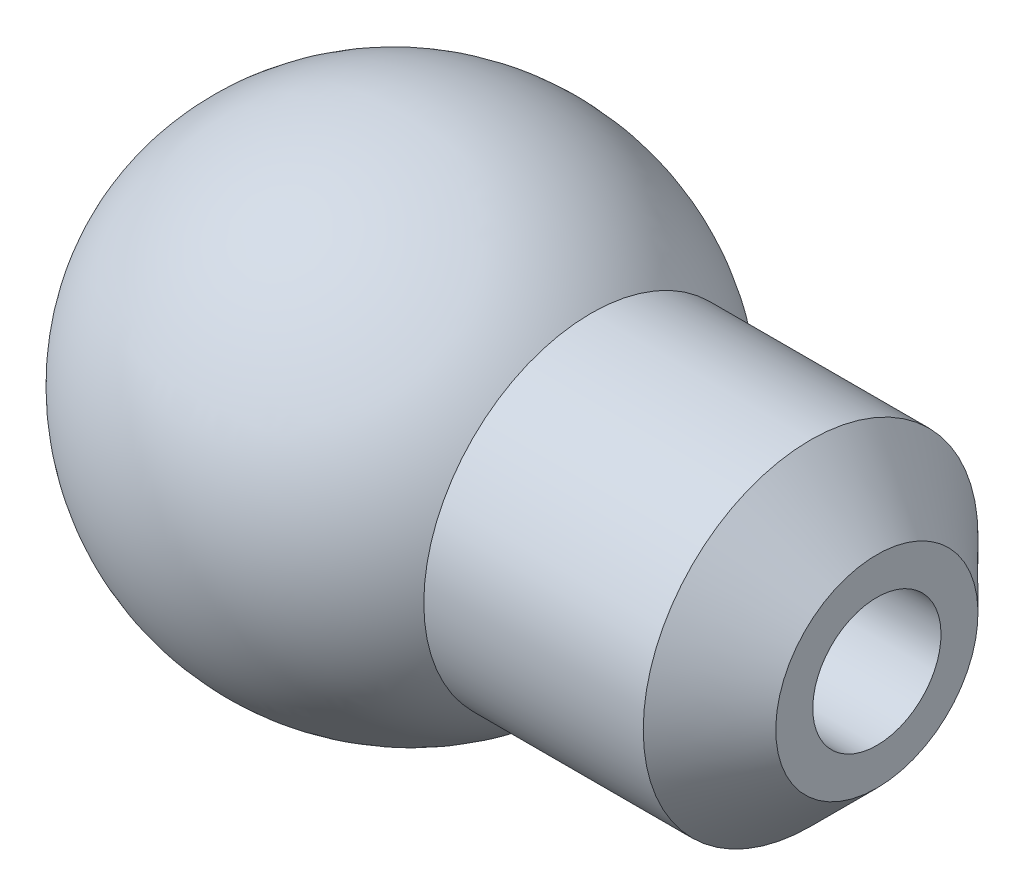
ISO-10303-21;
HEADER;
FILE_DESCRIPTION(('STEP AP214'),'2;1');
FILE_NAME('part.step','',(''),(''),'','','');
FILE_SCHEMA(('AUTOMOTIVE_DESIGN { 1 0 10303 214 1 1 1 1 }'));
ENDSEC;
DATA;
#1=APPLICATION_CONTEXT('core data for automotive mechanical design processes');
#2=APPLICATION_PROTOCOL_DEFINITION('international standard','automotive_design',2000,#1);
#3=PRODUCT_CONTEXT('',#1,'mechanical');
#4=PRODUCT('Part','Part','',(#3));
#5=PRODUCT_RELATED_PRODUCT_CATEGORY('part','',(#4));
#6=PRODUCT_DEFINITION_FORMATION('','',#4);
#7=PRODUCT_DEFINITION_CONTEXT('part definition',#1,'design');
#8=PRODUCT_DEFINITION('design','',#6,#7);
#9=PRODUCT_DEFINITION_SHAPE('','',#8);
#10=(LENGTH_UNIT() NAMED_UNIT(*) SI_UNIT(.MILLI.,.METRE.));
#11=(NAMED_UNIT(*) PLANE_ANGLE_UNIT() SI_UNIT($,.RADIAN.));
#12=(NAMED_UNIT(*) SI_UNIT($,.STERADIAN.) SOLID_ANGLE_UNIT());
#13=UNCERTAINTY_MEASURE_WITH_UNIT(LENGTH_MEASURE(1.E-05),#10,'distance_accuracy_value','');
#14=(GEOMETRIC_REPRESENTATION_CONTEXT(3) GLOBAL_UNCERTAINTY_ASSIGNED_CONTEXT((#13)) GLOBAL_UNIT_ASSIGNED_CONTEXT((#10,
#11,#12)) REPRESENTATION_CONTEXT('',''));
#15=CARTESIAN_POINT('',(0.,0.,0.));
#16=DIRECTION('',(0.,0.,1.));
#17=DIRECTION('',(1.,0.,0.));
#18=AXIS2_PLACEMENT_3D('',#15,#16,#17);
#19=CARTESIAN_POINT('',(0.,26.,0.));
#20=DIRECTION('',(-1.,0.,0.));
#21=DIRECTION('',(0.,-1.,0.));
#22=AXIS2_PLACEMENT_3D('',#19,#20,#21);
#23=PLANE('',#22);
#24=CARTESIAN_POINT('',(0.,0.,0.));
#25=DIRECTION('',(-1.,0.,0.));
#26=DIRECTION('',(0.,-1.,0.));
#27=AXIS2_PLACEMENT_3D('',#24,#25,#26);
#28=CIRCLE('',#27,26.);
#29=CARTESIAN_POINT('',(0.,-26.,0.));
#30=VERTEX_POINT('',#29);
#31=EDGE_CURVE('E65',#30,#30,#28,.T.);
#32=ORIENTED_EDGE('',*,*,#31,.F.);
#33=EDGE_LOOP('',(#32));
#34=FACE_BOUND('',#33,.T.);
#35=ADVANCED_FACE('F36',(#34),#23,.F.);
#36=CARTESIAN_POINT('',(-132.448093388028,8.05657132717041,0.));
#37=DIRECTION('',(0.,0.,-1.));
#38=DIRECTION('',(0.,-1.,0.));
#39=AXIS2_PLACEMENT_3D('',#36,#37,#38);
#40=CIRCLE('',#39,107.853238047915);
#41=TRIMMED_CURVE('',#40,(PARAMETER_VALUE(-1.4960272891652)),(PARAMETER_VALUE(1.4960272891652)),
.T.,.PARAMETER.);
#42=CARTESIAN_POINT('',(-132.448093388028,0.,0.));
#43=DIRECTION('',(-1.,0.,0.));
#44=AXIS1_PLACEMENT('',#42,#43);
#45=SURFACE_OF_REVOLUTION('',#41,#44);
#46=CARTESIAN_POINT('',(-240.,0.,0.));
#47=VERTEX_POINT('',#46);
#48=VERTEX_LOOP('',#47);
#49=FACE_BOUND('',#48,.T.);
#50=CARTESIAN_POINT('',(-55.8486941458997,0.,0.));
#51=DIRECTION('',(-1.,0.,0.));
#52=DIRECTION('',(0.,-1.,0.));
#53=AXIS2_PLACEMENT_3D('',#50,#51,#52);
#54=CIRCLE('',#53,67.8700576850886);
#55=CARTESIAN_POINT('',(-55.8486941458997,-67.8700576850887,0.));
#56=VERTEX_POINT('',#55);
#57=EDGE_CURVE('E11',#56,#56,#54,.T.);
#58=ORIENTED_EDGE('',*,*,#57,.T.);
#59=EDGE_LOOP('',(#58));
#60=FACE_BOUND('',#59,.T.);
#61=ADVANCED_FACE('F45',(#49,#60),#45,.T.);
#62=CARTESIAN_POINT('',(-240.,0.,0.));
#63=DIRECTION('',(-1.,0.,0.));
#64=DIRECTION('',(0.,-1.,0.));
#65=AXIS2_PLACEMENT_3D('',#62,#63,#64);
#66=CYLINDRICAL_SURFACE('',#65,67.8700576850887);
#67=ORIENTED_EDGE('',*,*,#57,.F.);
#68=EDGE_LOOP('',(#67));
#69=FACE_BOUND('',#68,.T.);
#70=CARTESIAN_POINT('',(33.1299423149111,0.,0.));
#71=DIRECTION('',(-1.,0.,0.));
#72=DIRECTION('',(0.,-1.,0.));
#73=AXIS2_PLACEMENT_3D('',#70,#71,#72);
#74=CIRCLE('',#73,67.8700576850886);
#75=CARTESIAN_POINT('',(33.1299423149111,-67.8700576850886,0.));
#76=VERTEX_POINT('',#75);
#77=EDGE_CURVE('E42',#76,#76,#74,.T.);
#78=ORIENTED_EDGE('',*,*,#77,.T.);
#79=EDGE_LOOP('',(#78));
#80=FACE_BOUND('',#79,.T.);
#81=ADVANCED_FACE('F48',(#69,#80),#66,.T.);
#82=CARTESIAN_POINT('',(60.,0.,0.));
#83=DIRECTION('',(-1.,0.,0.));
#84=DIRECTION('',(0.,-1.,0.));
#85=AXIS2_PLACEMENT_3D('',#82,#83,#84);
#86=CONICAL_SURFACE('',#85,41.,0.785398163397443);
#87=ORIENTED_EDGE('',*,*,#77,.F.);
#88=EDGE_LOOP('',(#87));
#89=FACE_BOUND('',#88,.T.);
#90=CARTESIAN_POINT('',(60.,0.,0.));
#91=DIRECTION('',(-1.,0.,0.));
#92=DIRECTION('',(0.,-1.,0.));
#93=AXIS2_PLACEMENT_3D('',#90,#91,#92);
#94=CIRCLE('',#93,41.);
#95=CARTESIAN_POINT('',(60.,-41.,0.));
#96=VERTEX_POINT('',#95);
#97=EDGE_CURVE('E58',#96,#96,#94,.T.);
#98=ORIENTED_EDGE('',*,*,#97,.T.);
#99=EDGE_LOOP('',(#98));
#100=FACE_BOUND('',#99,.T.);
#101=ADVANCED_FACE('F53',(#89,#100),#86,.T.);
#102=CARTESIAN_POINT('',(60.,26.,0.));
#103=DIRECTION('',(-1.,0.,0.));
#104=DIRECTION('',(0.,-1.,0.));
#105=AXIS2_PLACEMENT_3D('',#102,#103,#104);
#106=PLANE('',#105);
#107=ORIENTED_EDGE('',*,*,#97,.F.);
#108=EDGE_LOOP('',(#107));
#109=FACE_BOUND('',#108,.T.);
#110=CARTESIAN_POINT('',(60.,0.,0.));
#111=DIRECTION('',(-1.,0.,0.));
#112=DIRECTION('',(0.,-1.,0.));
#113=AXIS2_PLACEMENT_3D('',#110,#111,#112);
#114=CIRCLE('',#113,26.);
#115=CARTESIAN_POINT('',(60.,-26.,0.));
#116=VERTEX_POINT('',#115);
#117=EDGE_CURVE('E60',#116,#116,#114,.T.);
#118=ORIENTED_EDGE('',*,*,#117,.T.);
#119=EDGE_LOOP('',(#118));
#120=FACE_BOUND('',#119,.T.);
#121=ADVANCED_FACE('F88',(#109,#120),#106,.F.);
#122=CARTESIAN_POINT('',(-240.,0.,0.));
#123=DIRECTION('',(-1.,0.,0.));
#124=DIRECTION('',(0.,-1.,0.));
#125=AXIS2_PLACEMENT_3D('',#122,#123,#124);
#126=CYLINDRICAL_SURFACE('',#125,26.);
#127=ORIENTED_EDGE('',*,*,#117,.F.);
#128=EDGE_LOOP('',(#127));
#129=FACE_BOUND('',#128,.T.);
#130=ORIENTED_EDGE('',*,*,#31,.T.);
#131=EDGE_LOOP('',(#130));
#132=FACE_BOUND('',#131,.T.);
#133=ADVANCED_FACE('F69',(#129,#132),#126,.F.);
#134=CLOSED_SHELL('',(#35,#61,#81,#101,#121,#133));
#135=MANIFOLD_SOLID_BREP('B2',#134);
#136=ADVANCED_BREP_SHAPE_REPRESENTATION('',(#18,#135),#14);
#137=SHAPE_DEFINITION_REPRESENTATION(#9,#136);
ENDSEC;
END-ISO-10303-21;
